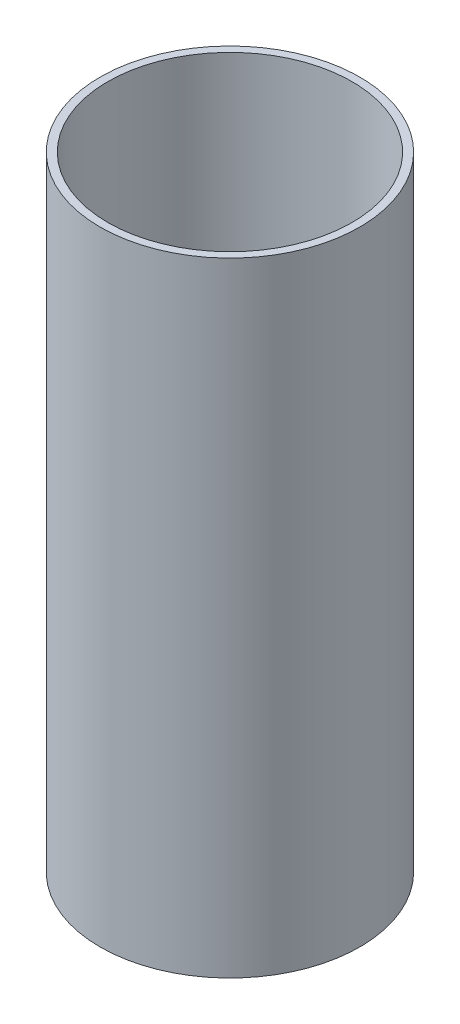
ISO-10303-21;
HEADER;
FILE_DESCRIPTION(('STEP AP214'),'2;1');
FILE_NAME('part.step','',(''),(''),'','','');
FILE_SCHEMA(('AUTOMOTIVE_DESIGN { 1 0 10303 214 1 1 1 1 }'));
ENDSEC;
DATA;
#1=APPLICATION_CONTEXT('core data for automotive mechanical design processes');
#2=APPLICATION_PROTOCOL_DEFINITION('international standard','automotive_design',2000,#1);
#3=PRODUCT_CONTEXT('',#1,'mechanical');
#4=PRODUCT('Part','Part','',(#3));
#5=PRODUCT_RELATED_PRODUCT_CATEGORY('part','',(#4));
#6=PRODUCT_DEFINITION_FORMATION('','',#4);
#7=PRODUCT_DEFINITION_CONTEXT('part definition',#1,'design');
#8=PRODUCT_DEFINITION('design','',#6,#7);
#9=PRODUCT_DEFINITION_SHAPE('','',#8);
#10=(LENGTH_UNIT() NAMED_UNIT(*) SI_UNIT(.MILLI.,.METRE.));
#11=(NAMED_UNIT(*) PLANE_ANGLE_UNIT() SI_UNIT($,.RADIAN.));
#12=(NAMED_UNIT(*) SI_UNIT($,.STERADIAN.) SOLID_ANGLE_UNIT());
#13=UNCERTAINTY_MEASURE_WITH_UNIT(LENGTH_MEASURE(1.E-05),#10,'distance_accuracy_value','');
#14=(GEOMETRIC_REPRESENTATION_CONTEXT(3) GLOBAL_UNCERTAINTY_ASSIGNED_CONTEXT((#13)) GLOBAL_UNIT_ASSIGNED_CONTEXT((#10,
#11,#12)) REPRESENTATION_CONTEXT('',''));
#15=CARTESIAN_POINT('',(0.,0.,0.));
#16=DIRECTION('',(0.,0.,1.));
#17=DIRECTION('',(1.,0.,0.));
#18=AXIS2_PLACEMENT_3D('',#15,#16,#17);
#19=CARTESIAN_POINT('',(0.,120.,0.));
#20=DIRECTION('',(0.,1.,0.));
#21=DIRECTION('',(0.,0.,1.));
#22=AXIS2_PLACEMENT_3D('',#19,#20,#21);
#23=PLANE('',#22);
#24=CARTESIAN_POINT('',(0.,120.,0.));
#25=DIRECTION('',(0.,1.,0.));
#26=DIRECTION('',(0.,0.,1.));
#27=AXIS2_PLACEMENT_3D('',#24,#25,#26);
#28=CIRCLE('',#27,25.);
#29=CARTESIAN_POINT('',(0.,120.,25.));
#30=VERTEX_POINT('',#29);
#31=EDGE_CURVE('E10',#30,#30,#28,.T.);
#32=ORIENTED_EDGE('',*,*,#31,.T.);
#33=EDGE_LOOP('',(#32));
#34=FACE_BOUND('',#33,.T.);
#35=CARTESIAN_POINT('',(0.,120.,0.));
#36=DIRECTION('',(0.,1.,0.));
#37=DIRECTION('',(0.,0.,1.));
#38=AXIS2_PLACEMENT_3D('',#35,#36,#37);
#39=CIRCLE('',#38,23.5);
#40=CARTESIAN_POINT('',(0.,120.,23.5));
#41=VERTEX_POINT('',#40);
#42=EDGE_CURVE('E50',#41,#41,#39,.T.);
#43=ORIENTED_EDGE('',*,*,#42,.F.);
#44=EDGE_LOOP('',(#43));
#45=FACE_BOUND('',#44,.T.);
#46=ADVANCED_FACE('F37',(#34,#45),#23,.T.);
#47=CARTESIAN_POINT('',(0.,0.,0.));
#48=DIRECTION('',(0.,1.,0.));
#49=DIRECTION('',(0.,0.,1.));
#50=AXIS2_PLACEMENT_3D('',#47,#48,#49);
#51=PLANE('',#50);
#52=CARTESIAN_POINT('',(0.,0.,0.));
#53=DIRECTION('',(0.,1.,0.));
#54=DIRECTION('',(0.,0.,1.));
#55=AXIS2_PLACEMENT_3D('',#52,#53,#54);
#56=CIRCLE('',#55,25.);
#57=CARTESIAN_POINT('',(0.,0.,25.));
#58=VERTEX_POINT('',#57);
#59=EDGE_CURVE('E41',#58,#58,#56,.T.);
#60=ORIENTED_EDGE('',*,*,#59,.F.);
#61=EDGE_LOOP('',(#60));
#62=FACE_BOUND('',#61,.T.);
#63=CARTESIAN_POINT('',(0.,0.,0.));
#64=DIRECTION('',(0.,1.,0.));
#65=DIRECTION('',(0.,0.,1.));
#66=AXIS2_PLACEMENT_3D('',#63,#64,#65);
#67=CIRCLE('',#66,23.5);
#68=CARTESIAN_POINT('',(0.,0.,23.5));
#69=VERTEX_POINT('',#68);
#70=EDGE_CURVE('E52',#69,#69,#67,.T.);
#71=ORIENTED_EDGE('',*,*,#70,.T.);
#72=EDGE_LOOP('',(#71));
#73=FACE_BOUND('',#72,.T.);
#74=ADVANCED_FACE('F64',(#62,#73),#51,.F.);
#75=CARTESIAN_POINT('',(0.,120.,0.));
#76=DIRECTION('',(0.,-1.,0.));
#77=DIRECTION('',(0.,0.,-1.));
#78=AXIS2_PLACEMENT_3D('',#75,#76,#77);
#79=CYLINDRICAL_SURFACE('',#78,25.);
#80=ORIENTED_EDGE('',*,*,#31,.F.);
#81=EDGE_LOOP('',(#80));
#82=FACE_BOUND('',#81,.T.);
#83=ORIENTED_EDGE('',*,*,#59,.T.);
#84=EDGE_LOOP('',(#83));
#85=FACE_BOUND('',#84,.T.);
#86=ADVANCED_FACE('F39',(#82,#85),#79,.T.);
#87=CARTESIAN_POINT('',(0.,120.,0.));
#88=DIRECTION('',(0.,-1.,0.));
#89=DIRECTION('',(0.,0.,-1.));
#90=AXIS2_PLACEMENT_3D('',#87,#88,#89);
#91=CYLINDRICAL_SURFACE('',#90,23.5);
#92=ORIENTED_EDGE('',*,*,#42,.T.);
#93=EDGE_LOOP('',(#92));
#94=FACE_BOUND('',#93,.T.);
#95=ORIENTED_EDGE('',*,*,#70,.F.);
#96=EDGE_LOOP('',(#95));
#97=FACE_BOUND('',#96,.T.);
#98=ADVANCED_FACE('F60',(#94,#97),#91,.F.);
#99=CLOSED_SHELL('',(#46,#74,#86,#98));
#100=MANIFOLD_SOLID_BREP('B2',#99);
#101=ADVANCED_BREP_SHAPE_REPRESENTATION('',(#18,#100),#14);
#102=SHAPE_DEFINITION_REPRESENTATION(#9,#101);
ENDSEC;
END-ISO-10303-21;
